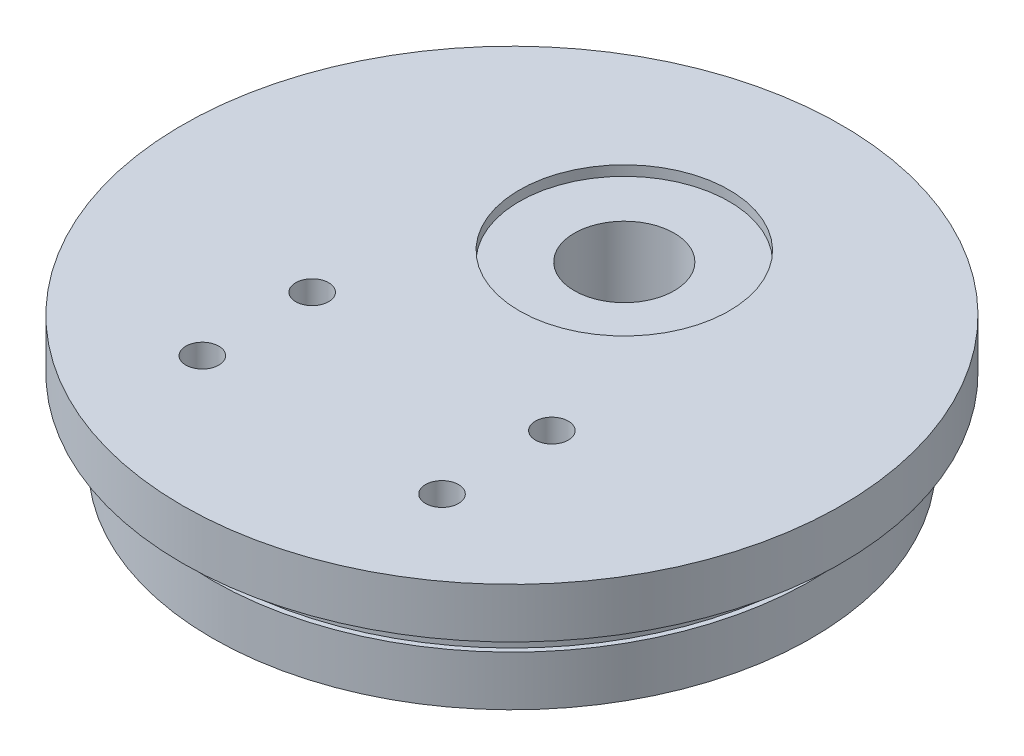
ISO-10303-21;
HEADER;
FILE_DESCRIPTION(('STEP AP214'),'2;1');
FILE_NAME('part.step','',(''),(''),'','','');
FILE_SCHEMA(('AUTOMOTIVE_DESIGN { 1 0 10303 214 1 1 1 1 }'));
ENDSEC;
DATA;
#1=APPLICATION_CONTEXT('core data for automotive mechanical design processes');
#2=APPLICATION_PROTOCOL_DEFINITION('international standard','automotive_design',2000,#1);
#3=PRODUCT_CONTEXT('',#1,'mechanical');
#4=PRODUCT('Part','Part','',(#3));
#5=PRODUCT_RELATED_PRODUCT_CATEGORY('part','',(#4));
#6=PRODUCT_DEFINITION_FORMATION('','',#4);
#7=PRODUCT_DEFINITION_CONTEXT('part definition',#1,'design');
#8=PRODUCT_DEFINITION('design','',#6,#7);
#9=PRODUCT_DEFINITION_SHAPE('','',#8);
#10=(LENGTH_UNIT() NAMED_UNIT(*) SI_UNIT(.MILLI.,.METRE.));
#11=(NAMED_UNIT(*) PLANE_ANGLE_UNIT() SI_UNIT($,.RADIAN.));
#12=(NAMED_UNIT(*) SI_UNIT($,.STERADIAN.) SOLID_ANGLE_UNIT());
#13=UNCERTAINTY_MEASURE_WITH_UNIT(LENGTH_MEASURE(1.E-05),#10,'distance_accuracy_value','');
#14=(GEOMETRIC_REPRESENTATION_CONTEXT(3) GLOBAL_UNCERTAINTY_ASSIGNED_CONTEXT((#13)) GLOBAL_UNIT_ASSIGNED_CONTEXT((#10,
#11,#12)) REPRESENTATION_CONTEXT('',''));
#15=CARTESIAN_POINT('',(0.,0.,0.));
#16=DIRECTION('',(0.,0.,1.));
#17=DIRECTION('',(1.,0.,0.));
#18=AXIS2_PLACEMENT_3D('',#15,#16,#17);
#19=CARTESIAN_POINT('',(0.,-13.,-11.25));
#20=DIRECTION('',(0.,1.,0.));
#21=DIRECTION('',(0.,0.,1.));
#22=AXIS2_PLACEMENT_3D('',#19,#20,#21);
#23=CYLINDRICAL_SURFACE('',#22,5.);
#24=CARTESIAN_POINT('',(0.,-13.,-11.25));
#25=DIRECTION('',(0.,1.,0.));
#26=DIRECTION('',(0.,0.,1.));
#27=AXIS2_PLACEMENT_3D('',#24,#25,#26);
#28=CIRCLE('',#27,5.);
#29=CARTESIAN_POINT('',(0.,-13.,-6.25));
#30=VERTEX_POINT('',#29);
#31=EDGE_CURVE('E170',#30,#30,#28,.T.);
#32=ORIENTED_EDGE('',*,*,#31,.F.);
#33=EDGE_LOOP('',(#32));
#34=FACE_BOUND('',#33,.T.);
#35=CARTESIAN_POINT('',(0.,-1.,-11.25));
#36=DIRECTION('',(0.,1.,0.));
#37=DIRECTION('',(0.,0.,1.));
#38=AXIS2_PLACEMENT_3D('',#35,#36,#37);
#39=CIRCLE('',#38,5.);
#40=CARTESIAN_POINT('',(0.,-1.,-6.25));
#41=VERTEX_POINT('',#40);
#42=EDGE_CURVE('E21',#41,#41,#39,.F.);
#43=ORIENTED_EDGE('',*,*,#42,.F.);
#44=EDGE_LOOP('',(#43));
#45=FACE_BOUND('',#44,.T.);
#46=ADVANCED_FACE('F17',(#34,#45),#23,.F.);
#47=CARTESIAN_POINT('',(0.,0.,0.));
#48=DIRECTION('',(0.,1.,0.));
#49=DIRECTION('',(0.,0.,1.));
#50=AXIS2_PLACEMENT_3D('',#47,#48,#49);
#51=PLANE('',#50);
#52=CARTESIAN_POINT('',(0.,0.,-11.25));
#53=DIRECTION('',(0.,1.,0.));
#54=DIRECTION('',(0.,0.,1.));
#55=AXIS2_PLACEMENT_3D('',#52,#53,#54);
#56=CIRCLE('',#55,10.5);
#57=CARTESIAN_POINT('',(0.,0.,-0.749999999999999));
#58=VERTEX_POINT('',#57);
#59=EDGE_CURVE('E206',#58,#58,#56,.T.);
#60=ORIENTED_EDGE('',*,*,#59,.F.);
#61=EDGE_LOOP('',(#60));
#62=FACE_BOUND('',#61,.T.);
#63=CARTESIAN_POINT('',(12.,0.,8.));
#64=DIRECTION('',(0.,1.,0.));
#65=DIRECTION('',(0.,0.,1.));
#66=AXIS2_PLACEMENT_3D('',#63,#64,#65);
#67=CIRCLE('',#66,1.65);
#68=CARTESIAN_POINT('',(12.,0.,9.65));
#69=VERTEX_POINT('',#68);
#70=EDGE_CURVE('E90',#69,#69,#67,.T.);
#71=ORIENTED_EDGE('',*,*,#70,.F.);
#72=EDGE_LOOP('',(#71));
#73=FACE_BOUND('',#72,.T.);
#74=CARTESIAN_POINT('',(-12.,0.,8.));
#75=DIRECTION('',(0.,1.,0.));
#76=DIRECTION('',(0.,0.,1.));
#77=AXIS2_PLACEMENT_3D('',#74,#75,#76);
#78=CIRCLE('',#77,1.65);
#79=CARTESIAN_POINT('',(-12.,0.,9.65));
#80=VERTEX_POINT('',#79);
#81=EDGE_CURVE('E89',#80,#80,#78,.T.);
#82=ORIENTED_EDGE('',*,*,#81,.F.);
#83=EDGE_LOOP('',(#82));
#84=FACE_BOUND('',#83,.T.);
#85=CARTESIAN_POINT('',(12.,0.,19.));
#86=DIRECTION('',(0.,1.,0.));
#87=DIRECTION('',(0.,0.,1.));
#88=AXIS2_PLACEMENT_3D('',#85,#86,#87);
#89=CIRCLE('',#88,1.65);
#90=CARTESIAN_POINT('',(12.,0.,20.65));
#91=VERTEX_POINT('',#90);
#92=EDGE_CURVE('E106',#91,#91,#89,.T.);
#93=ORIENTED_EDGE('',*,*,#92,.F.);
#94=EDGE_LOOP('',(#93));
#95=FACE_BOUND('',#94,.T.);
#96=CARTESIAN_POINT('',(-12.,0.,19.));
#97=DIRECTION('',(0.,1.,0.));
#98=DIRECTION('',(0.,0.,1.));
#99=AXIS2_PLACEMENT_3D('',#96,#97,#98);
#100=CIRCLE('',#99,1.65);
#101=CARTESIAN_POINT('',(-12.,0.,20.65));
#102=VERTEX_POINT('',#101);
#103=EDGE_CURVE('E114',#102,#102,#100,.T.);
#104=ORIENTED_EDGE('',*,*,#103,.F.);
#105=EDGE_LOOP('',(#104));
#106=FACE_BOUND('',#105,.T.);
#107=CARTESIAN_POINT('',(0.,0.,0.));
#108=DIRECTION('',(0.,1.,0.));
#109=DIRECTION('',(0.,0.,1.));
#110=AXIS2_PLACEMENT_3D('',#107,#108,#109);
#111=CIRCLE('',#110,33.);
#112=CARTESIAN_POINT('',(0.,0.,33.));
#113=VERTEX_POINT('',#112);
#114=EDGE_CURVE('E11',#113,#113,#111,.T.);
#115=ORIENTED_EDGE('',*,*,#114,.T.);
#116=EDGE_LOOP('',(#115));
#117=FACE_BOUND('',#116,.T.);
#118=ADVANCED_FACE('F19',(#62,#73,#84,#95,#106,#117),#51,.T.);
#119=CARTESIAN_POINT('',(0.,0.,0.));
#120=DIRECTION('',(0.,1.,0.));
#121=DIRECTION('',(0.,0.,1.));
#122=AXIS2_PLACEMENT_3D('',#119,#120,#121);
#123=CYLINDRICAL_SURFACE('',#122,33.);
#124=CARTESIAN_POINT('',(0.,-5.,0.));
#125=DIRECTION('',(0.,1.,0.));
#126=DIRECTION('',(0.,0.,1.));
#127=AXIS2_PLACEMENT_3D('',#124,#125,#126);
#128=CIRCLE('',#127,33.);
#129=CARTESIAN_POINT('',(0.,-5.,33.));
#130=VERTEX_POINT('',#129);
#131=EDGE_CURVE('E27',#130,#130,#128,.T.);
#132=ORIENTED_EDGE('',*,*,#131,.T.);
#133=EDGE_LOOP('',(#132));
#134=FACE_BOUND('',#133,.T.);
#135=ORIENTED_EDGE('',*,*,#114,.F.);
#136=EDGE_LOOP('',(#135));
#137=FACE_BOUND('',#136,.T.);
#138=ADVANCED_FACE('F183',(#134,#137),#123,.T.);
#139=CARTESIAN_POINT('',(-33.,-5.,0.));
#140=DIRECTION('',(0.,-1.,0.));
#141=DIRECTION('',(0.,0.,-1.));
#142=AXIS2_PLACEMENT_3D('',#139,#140,#141);
#143=PLANE('',#142);
#144=ORIENTED_EDGE('',*,*,#131,.F.);
#145=EDGE_LOOP('',(#144));
#146=FACE_BOUND('',#145,.T.);
#147=CARTESIAN_POINT('',(0.,-5.,0.));
#148=DIRECTION('',(0.,1.,0.));
#149=DIRECTION('',(0.,0.,1.));
#150=AXIS2_PLACEMENT_3D('',#147,#148,#149);
#151=CIRCLE('',#150,29.5);
#152=CARTESIAN_POINT('',(0.,-5.,29.5));
#153=VERTEX_POINT('',#152);
#154=EDGE_CURVE('E193',#153,#153,#151,.T.);
#155=ORIENTED_EDGE('',*,*,#154,.T.);
#156=EDGE_LOOP('',(#155));
#157=FACE_BOUND('',#156,.T.);
#158=ADVANCED_FACE('F186',(#146,#157),#143,.T.);
#159=CARTESIAN_POINT('',(0.,0.,0.));
#160=DIRECTION('',(0.,1.,0.));
#161=DIRECTION('',(0.,0.,1.));
#162=AXIS2_PLACEMENT_3D('',#159,#160,#161);
#163=CYLINDRICAL_SURFACE('',#162,30.);
#164=CARTESIAN_POINT('',(0.,-8.,0.));
#165=DIRECTION('',(0.,1.,0.));
#166=DIRECTION('',(0.,0.,1.));
#167=AXIS2_PLACEMENT_3D('',#164,#165,#166);
#168=CIRCLE('',#167,30.);
#169=CARTESIAN_POINT('',(0.,-8.,30.));
#170=VERTEX_POINT('',#169);
#171=EDGE_CURVE('E99',#170,#170,#168,.T.);
#172=ORIENTED_EDGE('',*,*,#171,.F.);
#173=EDGE_LOOP('',(#172));
#174=FACE_BOUND('',#173,.T.);
#175=CARTESIAN_POINT('',(0.,-13.,0.));
#176=DIRECTION('',(0.,1.,0.));
#177=DIRECTION('',(0.,0.,1.));
#178=AXIS2_PLACEMENT_3D('',#175,#176,#177);
#179=CIRCLE('',#178,30.);
#180=CARTESIAN_POINT('',(0.,-13.,30.));
#181=VERTEX_POINT('',#180);
#182=EDGE_CURVE('E174',#181,#181,#179,.T.);
#183=ORIENTED_EDGE('',*,*,#182,.T.);
#184=EDGE_LOOP('',(#183));
#185=FACE_BOUND('',#184,.T.);
#186=ADVANCED_FACE('F189',(#174,#185),#163,.T.);
#187=CARTESIAN_POINT('',(-30.,-13.,0.));
#188=DIRECTION('',(0.,-1.,0.));
#189=DIRECTION('',(0.,0.,-1.));
#190=AXIS2_PLACEMENT_3D('',#187,#188,#189);
#191=PLANE('',#190);
#192=CARTESIAN_POINT('',(18.75,-13.,-14.));
#193=DIRECTION('',(0.,-1.,0.));
#194=DIRECTION('',(0.,0.,-1.));
#195=AXIS2_PLACEMENT_3D('',#192,#193,#194);
#196=CIRCLE('',#195,1.65);
#197=CARTESIAN_POINT('',(18.75,-13.,-15.65));
#198=VERTEX_POINT('',#197);
#199=EDGE_CURVE('E122',#198,#198,#196,.T.);
#200=ORIENTED_EDGE('',*,*,#199,.F.);
#201=EDGE_LOOP('',(#200));
#202=FACE_BOUND('',#201,.T.);
#203=CARTESIAN_POINT('',(-18.75,-13.,-14.0000000000003));
#204=DIRECTION('',(0.,-1.,0.));
#205=DIRECTION('',(0.,0.,-1.));
#206=AXIS2_PLACEMENT_3D('',#203,#204,#205);
#207=CIRCLE('',#206,1.65);
#208=CARTESIAN_POINT('',(-18.75,-13.,-15.6500000000003));
#209=VERTEX_POINT('',#208);
#210=EDGE_CURVE('E130',#209,#209,#207,.T.);
#211=ORIENTED_EDGE('',*,*,#210,.F.);
#212=EDGE_LOOP('',(#211));
#213=FACE_BOUND('',#212,.T.);
#214=CARTESIAN_POINT('',(18.75,-13.,0.));
#215=DIRECTION('',(0.,-1.,0.));
#216=DIRECTION('',(0.,0.,-1.));
#217=AXIS2_PLACEMENT_3D('',#214,#215,#216);
#218=CIRCLE('',#217,1.65);
#219=CARTESIAN_POINT('',(18.75,-13.,-1.65));
#220=VERTEX_POINT('',#219);
#221=EDGE_CURVE('E138',#220,#220,#218,.T.);
#222=ORIENTED_EDGE('',*,*,#221,.F.);
#223=EDGE_LOOP('',(#222));
#224=FACE_BOUND('',#223,.T.);
#225=CARTESIAN_POINT('',(-18.75,-13.,-2.61943244872498E-13));
#226=DIRECTION('',(0.,-1.,0.));
#227=DIRECTION('',(0.,0.,-1.));
#228=AXIS2_PLACEMENT_3D('',#225,#226,#227);
#229=CIRCLE('',#228,1.65);
#230=CARTESIAN_POINT('',(-18.75,-13.,-1.65000000000026));
#231=VERTEX_POINT('',#230);
#232=EDGE_CURVE('E146',#231,#231,#229,.T.);
#233=ORIENTED_EDGE('',*,*,#232,.F.);
#234=EDGE_LOOP('',(#233));
#235=FACE_BOUND('',#234,.T.);
#236=CARTESIAN_POINT('',(18.75,-13.,14.));
#237=DIRECTION('',(0.,-1.,0.));
#238=DIRECTION('',(0.,0.,-1.));
#239=AXIS2_PLACEMENT_3D('',#236,#237,#238);
#240=CIRCLE('',#239,1.65);
#241=CARTESIAN_POINT('',(18.75,-13.,12.35));
#242=VERTEX_POINT('',#241);
#243=EDGE_CURVE('E154',#242,#242,#240,.T.);
#244=ORIENTED_EDGE('',*,*,#243,.F.);
#245=EDGE_LOOP('',(#244));
#246=FACE_BOUND('',#245,.T.);
#247=CARTESIAN_POINT('',(-18.75,-13.,13.9999999999997));
#248=DIRECTION('',(0.,-1.,0.));
#249=DIRECTION('',(0.,0.,-1.));
#250=AXIS2_PLACEMENT_3D('',#247,#248,#249);
#251=CIRCLE('',#250,1.65);
#252=CARTESIAN_POINT('',(-18.75,-13.,12.3499999999997));
#253=VERTEX_POINT('',#252);
#254=EDGE_CURVE('E162',#253,#253,#251,.T.);
#255=ORIENTED_EDGE('',*,*,#254,.F.);
#256=EDGE_LOOP('',(#255));
#257=FACE_BOUND('',#256,.T.);
#258=ORIENTED_EDGE('',*,*,#31,.T.);
#259=EDGE_LOOP('',(#258));
#260=FACE_BOUND('',#259,.T.);
#261=ORIENTED_EDGE('',*,*,#182,.F.);
#262=EDGE_LOOP('',(#261));
#263=FACE_BOUND('',#262,.T.);
#264=ADVANCED_FACE('F217',(#202,#213,#224,#235,#246,#257,#260,#263),#191,.T.);
#265=CARTESIAN_POINT('',(-18.75,-8.,13.9999999999997));
#266=DIRECTION('',(0.,-1.,0.));
#267=DIRECTION('',(0.,0.,-1.));
#268=AXIS2_PLACEMENT_3D('',#265,#266,#267);
#269=CONICAL_SURFACE('',#268,1.65,1.02974425867665);
#270=CARTESIAN_POINT('',(-18.75,-7.00857997860453,13.9999999999997));
#271=VERTEX_POINT('',#270);
#272=VERTEX_LOOP('',#271);
#273=FACE_BOUND('',#272,.T.);
#274=CARTESIAN_POINT('',(-18.75,-8.,13.9999999999997));
#275=DIRECTION('',(0.,-1.,0.));
#276=DIRECTION('',(0.,0.,-1.));
#277=AXIS2_PLACEMENT_3D('',#274,#275,#276);
#278=CIRCLE('',#277,1.65);
#279=CARTESIAN_POINT('',(-18.75,-8.,12.3499999999997));
#280=VERTEX_POINT('',#279);
#281=EDGE_CURVE('E166',#280,#280,#278,.T.);
#282=ORIENTED_EDGE('',*,*,#281,.T.);
#283=EDGE_LOOP('',(#282));
#284=FACE_BOUND('',#283,.T.);
#285=ADVANCED_FACE('F222',(#273,#284),#269,.F.);
#286=CARTESIAN_POINT('',(-18.75,-13.,13.9999999999997));
#287=DIRECTION('',(0.,-1.,0.));
#288=DIRECTION('',(0.,0.,-1.));
#289=AXIS2_PLACEMENT_3D('',#286,#287,#288);
#290=CYLINDRICAL_SURFACE('',#289,1.65);
#291=ORIENTED_EDGE('',*,*,#281,.F.);
#292=EDGE_LOOP('',(#291));
#293=FACE_BOUND('',#292,.T.);
#294=ORIENTED_EDGE('',*,*,#254,.T.);
#295=EDGE_LOOP('',(#294));
#296=FACE_BOUND('',#295,.T.);
#297=ADVANCED_FACE('F229',(#293,#296),#290,.F.);
#298=CARTESIAN_POINT('',(18.75,-8.,14.));
#299=DIRECTION('',(0.,-1.,0.));
#300=DIRECTION('',(0.,0.,-1.));
#301=AXIS2_PLACEMENT_3D('',#298,#299,#300);
#302=CONICAL_SURFACE('',#301,1.65,1.02974425867665);
#303=CARTESIAN_POINT('',(18.75,-7.00857997860453,14.));
#304=VERTEX_POINT('',#303);
#305=VERTEX_LOOP('',#304);
#306=FACE_BOUND('',#305,.T.);
#307=CARTESIAN_POINT('',(18.75,-8.,14.));
#308=DIRECTION('',(0.,-1.,0.));
#309=DIRECTION('',(0.,0.,-1.));
#310=AXIS2_PLACEMENT_3D('',#307,#308,#309);
#311=CIRCLE('',#310,1.65);
#312=CARTESIAN_POINT('',(18.75,-8.,12.35));
#313=VERTEX_POINT('',#312);
#314=EDGE_CURVE('E158',#313,#313,#311,.T.);
#315=ORIENTED_EDGE('',*,*,#314,.T.);
#316=EDGE_LOOP('',(#315));
#317=FACE_BOUND('',#316,.T.);
#318=ADVANCED_FACE('F245',(#306,#317),#302,.F.);
#319=CARTESIAN_POINT('',(18.75,-13.,14.));
#320=DIRECTION('',(0.,-1.,0.));
#321=DIRECTION('',(0.,0.,-1.));
#322=AXIS2_PLACEMENT_3D('',#319,#320,#321);
#323=CYLINDRICAL_SURFACE('',#322,1.65);
#324=ORIENTED_EDGE('',*,*,#314,.F.);
#325=EDGE_LOOP('',(#324));
#326=FACE_BOUND('',#325,.T.);
#327=ORIENTED_EDGE('',*,*,#243,.T.);
#328=EDGE_LOOP('',(#327));
#329=FACE_BOUND('',#328,.T.);
#330=ADVANCED_FACE('F249',(#326,#329),#323,.F.);
#331=CARTESIAN_POINT('',(-18.75,-8.,-2.61943244872498E-13));
#332=DIRECTION('',(0.,-1.,0.));
#333=DIRECTION('',(0.,0.,-1.));
#334=AXIS2_PLACEMENT_3D('',#331,#332,#333);
#335=CONICAL_SURFACE('',#334,1.65,1.02974425867665);
#336=CARTESIAN_POINT('',(-18.75,-7.00857997860453,-2.61943244872498E-13));
#337=VERTEX_POINT('',#336);
#338=VERTEX_LOOP('',#337);
#339=FACE_BOUND('',#338,.T.);
#340=CARTESIAN_POINT('',(-18.75,-8.,-2.61943244872498E-13));
#341=DIRECTION('',(0.,-1.,0.));
#342=DIRECTION('',(0.,0.,-1.));
#343=AXIS2_PLACEMENT_3D('',#340,#341,#342);
#344=CIRCLE('',#343,1.65);
#345=CARTESIAN_POINT('',(-18.75,-8.,-1.65000000000026));
#346=VERTEX_POINT('',#345);
#347=EDGE_CURVE('E150',#346,#346,#344,.T.);
#348=ORIENTED_EDGE('',*,*,#347,.T.);
#349=EDGE_LOOP('',(#348));
#350=FACE_BOUND('',#349,.T.);
#351=ADVANCED_FACE('F252',(#339,#350),#335,.F.);
#352=CARTESIAN_POINT('',(-18.75,-13.,-2.61943244872498E-13));
#353=DIRECTION('',(0.,-1.,0.));
#354=DIRECTION('',(0.,0.,-1.));
#355=AXIS2_PLACEMENT_3D('',#352,#353,#354);
#356=CYLINDRICAL_SURFACE('',#355,1.65);
#357=ORIENTED_EDGE('',*,*,#347,.F.);
#358=EDGE_LOOP('',(#357));
#359=FACE_BOUND('',#358,.T.);
#360=ORIENTED_EDGE('',*,*,#232,.T.);
#361=EDGE_LOOP('',(#360));
#362=FACE_BOUND('',#361,.T.);
#363=ADVANCED_FACE('F256',(#359,#362),#356,.F.);
#364=CARTESIAN_POINT('',(18.75,-8.,0.));
#365=DIRECTION('',(0.,-1.,0.));
#366=DIRECTION('',(0.,0.,-1.));
#367=AXIS2_PLACEMENT_3D('',#364,#365,#366);
#368=CONICAL_SURFACE('',#367,1.65,1.02974425867665);
#369=CARTESIAN_POINT('',(18.75,-7.00857997860453,0.));
#370=VERTEX_POINT('',#369);
#371=VERTEX_LOOP('',#370);
#372=FACE_BOUND('',#371,.T.);
#373=CARTESIAN_POINT('',(18.75,-8.,0.));
#374=DIRECTION('',(0.,-1.,0.));
#375=DIRECTION('',(0.,0.,-1.));
#376=AXIS2_PLACEMENT_3D('',#373,#374,#375);
#377=CIRCLE('',#376,1.65);
#378=CARTESIAN_POINT('',(18.75,-8.,-1.65));
#379=VERTEX_POINT('',#378);
#380=EDGE_CURVE('E142',#379,#379,#377,.T.);
#381=ORIENTED_EDGE('',*,*,#380,.T.);
#382=EDGE_LOOP('',(#381));
#383=FACE_BOUND('',#382,.T.);
#384=ADVANCED_FACE('F260',(#372,#383),#368,.F.);
#385=CARTESIAN_POINT('',(18.75,-13.,0.));
#386=DIRECTION('',(0.,-1.,0.));
#387=DIRECTION('',(0.,0.,-1.));
#388=AXIS2_PLACEMENT_3D('',#385,#386,#387);
#389=CYLINDRICAL_SURFACE('',#388,1.65);
#390=ORIENTED_EDGE('',*,*,#380,.F.);
#391=EDGE_LOOP('',(#390));
#392=FACE_BOUND('',#391,.T.);
#393=ORIENTED_EDGE('',*,*,#221,.T.);
#394=EDGE_LOOP('',(#393));
#395=FACE_BOUND('',#394,.T.);
#396=ADVANCED_FACE('F264',(#392,#395),#389,.F.);
#397=CARTESIAN_POINT('',(-18.75,-8.,-14.0000000000003));
#398=DIRECTION('',(0.,-1.,0.));
#399=DIRECTION('',(0.,0.,-1.));
#400=AXIS2_PLACEMENT_3D('',#397,#398,#399);
#401=CONICAL_SURFACE('',#400,1.65,1.02974425867665);
#402=CARTESIAN_POINT('',(-18.75,-7.00857997860453,-14.0000000000003));
#403=VERTEX_POINT('',#402);
#404=VERTEX_LOOP('',#403);
#405=FACE_BOUND('',#404,.T.);
#406=CARTESIAN_POINT('',(-18.75,-8.,-14.0000000000003));
#407=DIRECTION('',(0.,-1.,0.));
#408=DIRECTION('',(0.,0.,-1.));
#409=AXIS2_PLACEMENT_3D('',#406,#407,#408);
#410=CIRCLE('',#409,1.65);
#411=CARTESIAN_POINT('',(-18.75,-8.,-15.6500000000003));
#412=VERTEX_POINT('',#411);
#413=EDGE_CURVE('E134',#412,#412,#410,.T.);
#414=ORIENTED_EDGE('',*,*,#413,.T.);
#415=EDGE_LOOP('',(#414));
#416=FACE_BOUND('',#415,.T.);
#417=ADVANCED_FACE('F268',(#405,#416),#401,.F.);
#418=CARTESIAN_POINT('',(-18.75,-13.,-14.0000000000003));
#419=DIRECTION('',(0.,-1.,0.));
#420=DIRECTION('',(0.,0.,-1.));
#421=AXIS2_PLACEMENT_3D('',#418,#419,#420);
#422=CYLINDRICAL_SURFACE('',#421,1.65);
#423=ORIENTED_EDGE('',*,*,#413,.F.);
#424=EDGE_LOOP('',(#423));
#425=FACE_BOUND('',#424,.T.);
#426=ORIENTED_EDGE('',*,*,#210,.T.);
#427=EDGE_LOOP('',(#426));
#428=FACE_BOUND('',#427,.T.);
#429=ADVANCED_FACE('F272',(#425,#428),#422,.F.);
#430=CARTESIAN_POINT('',(18.75,-8.,-14.));
#431=DIRECTION('',(0.,-1.,0.));
#432=DIRECTION('',(0.,0.,-1.));
#433=AXIS2_PLACEMENT_3D('',#430,#431,#432);
#434=CONICAL_SURFACE('',#433,1.65,1.02974425867665);
#435=CARTESIAN_POINT('',(18.75,-7.00857997860453,-14.));
#436=VERTEX_POINT('',#435);
#437=VERTEX_LOOP('',#436);
#438=FACE_BOUND('',#437,.T.);
#439=CARTESIAN_POINT('',(18.75,-8.,-14.));
#440=DIRECTION('',(0.,-1.,0.));
#441=DIRECTION('',(0.,0.,-1.));
#442=AXIS2_PLACEMENT_3D('',#439,#440,#441);
#443=CIRCLE('',#442,1.65);
#444=CARTESIAN_POINT('',(18.75,-8.,-15.65));
#445=VERTEX_POINT('',#444);
#446=EDGE_CURVE('E126',#445,#445,#443,.T.);
#447=ORIENTED_EDGE('',*,*,#446,.T.);
#448=EDGE_LOOP('',(#447));
#449=FACE_BOUND('',#448,.T.);
#450=ADVANCED_FACE('F276',(#438,#449),#434,.F.);
#451=CARTESIAN_POINT('',(18.75,-13.,-14.));
#452=DIRECTION('',(0.,-1.,0.));
#453=DIRECTION('',(0.,0.,-1.));
#454=AXIS2_PLACEMENT_3D('',#451,#452,#453);
#455=CYLINDRICAL_SURFACE('',#454,1.65);
#456=ORIENTED_EDGE('',*,*,#446,.F.);
#457=EDGE_LOOP('',(#456));
#458=FACE_BOUND('',#457,.T.);
#459=ORIENTED_EDGE('',*,*,#199,.T.);
#460=EDGE_LOOP('',(#459));
#461=FACE_BOUND('',#460,.T.);
#462=ADVANCED_FACE('F280',(#458,#461),#455,.F.);
#463=CARTESIAN_POINT('',(-12.,-6.,19.));
#464=DIRECTION('',(0.,1.,0.));
#465=DIRECTION('',(0.,0.,1.));
#466=AXIS2_PLACEMENT_3D('',#463,#464,#465);
#467=CONICAL_SURFACE('',#466,1.65,1.02974425867665);
#468=CARTESIAN_POINT('',(-12.,-6.99142002139548,19.));
#469=VERTEX_POINT('',#468);
#470=VERTEX_LOOP('',#469);
#471=FACE_BOUND('',#470,.T.);
#472=CARTESIAN_POINT('',(-12.,-6.,19.));
#473=DIRECTION('',(0.,1.,0.));
#474=DIRECTION('',(0.,0.,1.));
#475=AXIS2_PLACEMENT_3D('',#472,#473,#474);
#476=CIRCLE('',#475,1.65);
#477=CARTESIAN_POINT('',(-12.,-6.,20.65));
#478=VERTEX_POINT('',#477);
#479=EDGE_CURVE('E118',#478,#478,#476,.T.);
#480=ORIENTED_EDGE('',*,*,#479,.T.);
#481=EDGE_LOOP('',(#480));
#482=FACE_BOUND('',#481,.T.);
#483=ADVANCED_FACE('F284',(#471,#482),#467,.F.);
#484=CARTESIAN_POINT('',(-12.,0.,19.));
#485=DIRECTION('',(0.,1.,0.));
#486=DIRECTION('',(0.,0.,1.));
#487=AXIS2_PLACEMENT_3D('',#484,#485,#486);
#488=CYLINDRICAL_SURFACE('',#487,1.65);
#489=ORIENTED_EDGE('',*,*,#479,.F.);
#490=EDGE_LOOP('',(#489));
#491=FACE_BOUND('',#490,.T.);
#492=ORIENTED_EDGE('',*,*,#103,.T.);
#493=EDGE_LOOP('',(#492));
#494=FACE_BOUND('',#493,.T.);
#495=ADVANCED_FACE('F288',(#491,#494),#488,.F.);
#496=CARTESIAN_POINT('',(12.,-6.,19.));
#497=DIRECTION('',(0.,1.,0.));
#498=DIRECTION('',(0.,0.,1.));
#499=AXIS2_PLACEMENT_3D('',#496,#497,#498);
#500=CONICAL_SURFACE('',#499,1.65,1.02974425867665);
#501=CARTESIAN_POINT('',(12.,-6.99142002139548,19.));
#502=VERTEX_POINT('',#501);
#503=VERTEX_LOOP('',#502);
#504=FACE_BOUND('',#503,.T.);
#505=CARTESIAN_POINT('',(12.,-6.,19.));
#506=DIRECTION('',(0.,1.,0.));
#507=DIRECTION('',(0.,0.,1.));
#508=AXIS2_PLACEMENT_3D('',#505,#506,#507);
#509=CIRCLE('',#508,1.65);
#510=CARTESIAN_POINT('',(12.,-6.,20.65));
#511=VERTEX_POINT('',#510);
#512=EDGE_CURVE('E110',#511,#511,#509,.T.);
#513=ORIENTED_EDGE('',*,*,#512,.T.);
#514=EDGE_LOOP('',(#513));
#515=FACE_BOUND('',#514,.T.);
#516=ADVANCED_FACE('F292',(#504,#515),#500,.F.);
#517=CARTESIAN_POINT('',(12.,0.,19.));
#518=DIRECTION('',(0.,1.,0.));
#519=DIRECTION('',(0.,0.,1.));
#520=AXIS2_PLACEMENT_3D('',#517,#518,#519);
#521=CYLINDRICAL_SURFACE('',#520,1.65);
#522=ORIENTED_EDGE('',*,*,#512,.F.);
#523=EDGE_LOOP('',(#522));
#524=FACE_BOUND('',#523,.T.);
#525=ORIENTED_EDGE('',*,*,#92,.T.);
#526=EDGE_LOOP('',(#525));
#527=FACE_BOUND('',#526,.T.);
#528=ADVANCED_FACE('F296',(#524,#527),#521,.F.);
#529=CARTESIAN_POINT('',(-12.,-6.,8.));
#530=DIRECTION('',(0.,1.,0.));
#531=DIRECTION('',(0.,0.,1.));
#532=AXIS2_PLACEMENT_3D('',#529,#530,#531);
#533=CONICAL_SURFACE('',#532,1.65,1.02974425867665);
#534=CARTESIAN_POINT('',(-12.,-6.99142002139548,8.));
#535=VERTEX_POINT('',#534);
#536=VERTEX_LOOP('',#535);
#537=FACE_BOUND('',#536,.T.);
#538=CARTESIAN_POINT('',(-12.,-6.,8.));
#539=DIRECTION('',(0.,1.,0.));
#540=DIRECTION('',(0.,0.,1.));
#541=AXIS2_PLACEMENT_3D('',#538,#539,#540);
#542=CIRCLE('',#541,1.65);
#543=CARTESIAN_POINT('',(-12.,-6.,9.65));
#544=VERTEX_POINT('',#543);
#545=EDGE_CURVE('E96',#544,#544,#542,.T.);
#546=ORIENTED_EDGE('',*,*,#545,.T.);
#547=EDGE_LOOP('',(#546));
#548=FACE_BOUND('',#547,.T.);
#549=ADVANCED_FACE('F300',(#537,#548),#533,.F.);
#550=CARTESIAN_POINT('',(-12.,0.,8.));
#551=DIRECTION('',(0.,1.,0.));
#552=DIRECTION('',(0.,0.,1.));
#553=AXIS2_PLACEMENT_3D('',#550,#551,#552);
#554=CYLINDRICAL_SURFACE('',#553,1.65);
#555=ORIENTED_EDGE('',*,*,#545,.F.);
#556=EDGE_LOOP('',(#555));
#557=FACE_BOUND('',#556,.T.);
#558=ORIENTED_EDGE('',*,*,#81,.T.);
#559=EDGE_LOOP('',(#558));
#560=FACE_BOUND('',#559,.T.);
#561=ADVANCED_FACE('F82',(#557,#560),#554,.F.);
#562=CARTESIAN_POINT('',(12.,-6.,8.));
#563=DIRECTION('',(0.,1.,0.));
#564=DIRECTION('',(0.,0.,1.));
#565=AXIS2_PLACEMENT_3D('',#562,#563,#564);
#566=CONICAL_SURFACE('',#565,1.65,1.02974425867665);
#567=CARTESIAN_POINT('',(12.,-6.99142002139548,8.));
#568=VERTEX_POINT('',#567);
#569=VERTEX_LOOP('',#568);
#570=FACE_BOUND('',#569,.T.);
#571=CARTESIAN_POINT('',(12.,-6.,8.));
#572=DIRECTION('',(0.,1.,0.));
#573=DIRECTION('',(0.,0.,1.));
#574=AXIS2_PLACEMENT_3D('',#571,#572,#573);
#575=CIRCLE('',#574,1.65);
#576=CARTESIAN_POINT('',(12.,-6.,9.65));
#577=VERTEX_POINT('',#576);
#578=EDGE_CURVE('E86',#577,#577,#575,.T.);
#579=ORIENTED_EDGE('',*,*,#578,.T.);
#580=EDGE_LOOP('',(#579));
#581=FACE_BOUND('',#580,.T.);
#582=ADVANCED_FACE('F78',(#570,#581),#566,.F.);
#583=CARTESIAN_POINT('',(12.,0.,8.));
#584=DIRECTION('',(0.,1.,0.));
#585=DIRECTION('',(0.,0.,1.));
#586=AXIS2_PLACEMENT_3D('',#583,#584,#585);
#587=CYLINDRICAL_SURFACE('',#586,1.65);
#588=ORIENTED_EDGE('',*,*,#578,.F.);
#589=EDGE_LOOP('',(#588));
#590=FACE_BOUND('',#589,.T.);
#591=ORIENTED_EDGE('',*,*,#70,.T.);
#592=EDGE_LOOP('',(#591));
#593=FACE_BOUND('',#592,.T.);
#594=ADVANCED_FACE('F81',(#590,#593),#587,.F.);
#595=CARTESIAN_POINT('',(-30.,-8.,0.));
#596=DIRECTION('',(0.,-1.,0.));
#597=DIRECTION('',(0.,0.,-1.));
#598=AXIS2_PLACEMENT_3D('',#595,#596,#597);
#599=PLANE('',#598);
#600=CARTESIAN_POINT('',(0.,-8.,0.));
#601=DIRECTION('',(0.,1.,0.));
#602=DIRECTION('',(0.,0.,1.));
#603=AXIS2_PLACEMENT_3D('',#600,#601,#602);
#604=CIRCLE('',#603,29.5);
#605=CARTESIAN_POINT('',(0.,-8.,29.5));
#606=VERTEX_POINT('',#605);
#607=EDGE_CURVE('E196',#606,#606,#604,.T.);
#608=ORIENTED_EDGE('',*,*,#607,.F.);
#609=EDGE_LOOP('',(#608));
#610=FACE_BOUND('',#609,.T.);
#611=ORIENTED_EDGE('',*,*,#171,.T.);
#612=EDGE_LOOP('',(#611));
#613=FACE_BOUND('',#612,.T.);
#614=ADVANCED_FACE('F213',(#610,#613),#599,.F.);
#615=CARTESIAN_POINT('',(0.,0.,0.));
#616=DIRECTION('',(0.,1.,0.));
#617=DIRECTION('',(0.,0.,1.));
#618=AXIS2_PLACEMENT_3D('',#615,#616,#617);
#619=CYLINDRICAL_SURFACE('',#618,29.5);
#620=ORIENTED_EDGE('',*,*,#154,.F.);
#621=EDGE_LOOP('',(#620));
#622=FACE_BOUND('',#621,.T.);
#623=ORIENTED_EDGE('',*,*,#607,.T.);
#624=EDGE_LOOP('',(#623));
#625=FACE_BOUND('',#624,.T.);
#626=ADVANCED_FACE('F312',(#622,#625),#619,.T.);
#627=CARTESIAN_POINT('',(0.,-1.,-11.25));
#628=DIRECTION('',(0.,1.,0.));
#629=DIRECTION('',(0.,0.,1.));
#630=AXIS2_PLACEMENT_3D('',#627,#628,#629);
#631=PLANE('',#630);
#632=CARTESIAN_POINT('',(0.,-1.,-11.25));
#633=DIRECTION('',(0.,1.,0.));
#634=DIRECTION('',(0.,0.,1.));
#635=AXIS2_PLACEMENT_3D('',#632,#633,#634);
#636=CIRCLE('',#635,10.5);
#637=CARTESIAN_POINT('',(0.,-1.,-0.749999999999999));
#638=VERTEX_POINT('',#637);
#639=EDGE_CURVE('E204',#638,#638,#636,.T.);
#640=ORIENTED_EDGE('',*,*,#639,.T.);
#641=EDGE_LOOP('',(#640));
#642=FACE_BOUND('',#641,.T.);
#643=ORIENTED_EDGE('',*,*,#42,.T.);
#644=EDGE_LOOP('',(#643));
#645=FACE_BOUND('',#644,.T.);
#646=ADVANCED_FACE('F316',(#642,#645),#631,.T.);
#647=CARTESIAN_POINT('',(0.,-1.,-11.25));
#648=DIRECTION('',(0.,1.,0.));
#649=DIRECTION('',(0.,0.,1.));
#650=AXIS2_PLACEMENT_3D('',#647,#648,#649);
#651=CYLINDRICAL_SURFACE('',#650,10.5);
#652=ORIENTED_EDGE('',*,*,#639,.F.);
#653=EDGE_LOOP('',(#652));
#654=FACE_BOUND('',#653,.T.);
#655=ORIENTED_EDGE('',*,*,#59,.T.);
#656=EDGE_LOOP('',(#655));
#657=FACE_BOUND('',#656,.T.);
#658=ADVANCED_FACE('F317',(#654,#657),#651,.F.);
#659=CLOSED_SHELL('',(#46,#118,#138,#158,#186,#264,#285,#297,#318,#330,#351,#363,#384,#396,#417,
#429,#450,#462,#483,#495,#516,#528,#549,#561,#582,#594,#614,#626,#646,#658));
#660=MANIFOLD_SOLID_BREP('B1',#659);
#661=ADVANCED_BREP_SHAPE_REPRESENTATION('',(#18,#660),#14);
#662=SHAPE_DEFINITION_REPRESENTATION(#9,#661);
ENDSEC;
END-ISO-10303-21;
